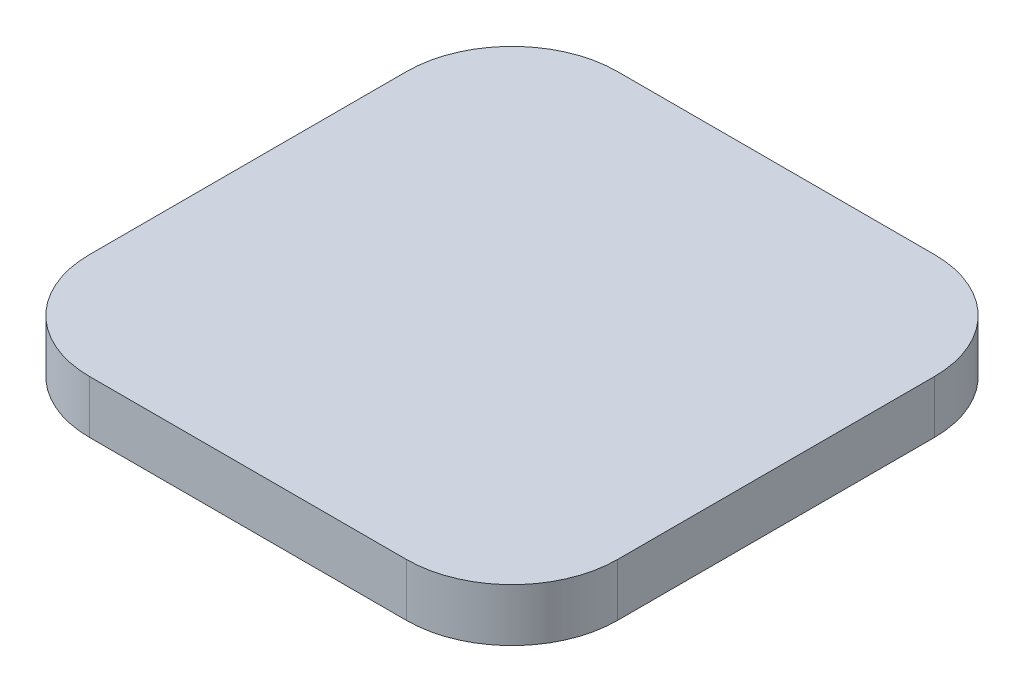
ISO-10303-21;
HEADER;
FILE_DESCRIPTION(('STEP AP214'),'2;1');
FILE_NAME('part.step','',(''),(''),'','','');
FILE_SCHEMA(('AUTOMOTIVE_DESIGN { 1 0 10303 214 1 1 1 1 }'));
ENDSEC;
DATA;
#1=APPLICATION_CONTEXT('core data for automotive mechanical design processes');
#2=APPLICATION_PROTOCOL_DEFINITION('international standard','automotive_design',2000,#1);
#3=PRODUCT_CONTEXT('',#1,'mechanical');
#4=PRODUCT('Part','Part','',(#3));
#5=PRODUCT_RELATED_PRODUCT_CATEGORY('part','',(#4));
#6=PRODUCT_DEFINITION_FORMATION('','',#4);
#7=PRODUCT_DEFINITION_CONTEXT('part definition',#1,'design');
#8=PRODUCT_DEFINITION('design','',#6,#7);
#9=PRODUCT_DEFINITION_SHAPE('','',#8);
#10=(LENGTH_UNIT() NAMED_UNIT(*) SI_UNIT(.MILLI.,.METRE.));
#11=(NAMED_UNIT(*) PLANE_ANGLE_UNIT() SI_UNIT($,.RADIAN.));
#12=(NAMED_UNIT(*) SI_UNIT($,.STERADIAN.) SOLID_ANGLE_UNIT());
#13=UNCERTAINTY_MEASURE_WITH_UNIT(LENGTH_MEASURE(1.E-05),#10,'distance_accuracy_value','');
#14=(GEOMETRIC_REPRESENTATION_CONTEXT(3) GLOBAL_UNCERTAINTY_ASSIGNED_CONTEXT((#13)) GLOBAL_UNIT_ASSIGNED_CONTEXT((#10,
#11,#12)) REPRESENTATION_CONTEXT('',''));
#15=CARTESIAN_POINT('',(0.,0.,0.));
#16=DIRECTION('',(0.,0.,1.));
#17=DIRECTION('',(1.,0.,0.));
#18=AXIS2_PLACEMENT_3D('',#15,#16,#17);
#19=CARTESIAN_POINT('',(25.4,5.08,25.4));
#20=DIRECTION('',(-1.,0.,0.));
#21=DIRECTION('',(0.,0.,1.));
#22=AXIS2_PLACEMENT_3D('',#19,#20,#21);
#23=PLANE('',#22);
#24=DIRECTION('',(0.,0.,-1.));
#25=VECTOR('',#24,1.);
#26=CARTESIAN_POINT('',(25.4,0.,25.4));
#27=LINE('',#26,#25);
#28=CARTESIAN_POINT('',(25.4,0.,15.24));
#29=VERTEX_POINT('',#28);
#30=CARTESIAN_POINT('',(25.4,0.,-15.24));
#31=VERTEX_POINT('',#30);
#32=EDGE_CURVE('E128',#29,#31,#27,.T.);
#33=ORIENTED_EDGE('',*,*,#32,.T.);
#34=DIRECTION('',(0.,-1.,0.));
#35=VECTOR('',#34,1.);
#36=CARTESIAN_POINT('',(25.4,5.08,-15.24));
#37=LINE('',#36,#35);
#38=CARTESIAN_POINT('',(25.4,5.08,-15.24));
#39=VERTEX_POINT('',#38);
#40=EDGE_CURVE('E151',#31,#39,#37,.F.);
#41=ORIENTED_EDGE('',*,*,#40,.T.);
#42=DIRECTION('',(0.,0.,-1.));
#43=VECTOR('',#42,1.);
#44=CARTESIAN_POINT('',(25.4,5.08,25.4));
#45=LINE('',#44,#43);
#46=CARTESIAN_POINT('',(25.4,5.08,15.24));
#47=VERTEX_POINT('',#46);
#48=EDGE_CURVE('E126',#47,#39,#45,.T.);
#49=ORIENTED_EDGE('',*,*,#48,.F.);
#50=DIRECTION('',(0.,-1.,0.));
#51=VECTOR('',#50,1.);
#52=CARTESIAN_POINT('',(25.4,5.08,15.24));
#53=LINE('',#52,#51);
#54=EDGE_CURVE('E148',#47,#29,#53,.T.);
#55=ORIENTED_EDGE('',*,*,#54,.T.);
#56=EDGE_LOOP('',(#33,#41,#49,#55));
#57=FACE_BOUND('',#56,.T.);
#58=ADVANCED_FACE('F33',(#57),#23,.F.);
#59=CARTESIAN_POINT('',(-25.4,5.08,-25.4));
#60=DIRECTION('',(0.,0.,1.));
#61=DIRECTION('',(1.,0.,0.));
#62=AXIS2_PLACEMENT_3D('',#59,#60,#61);
#63=PLANE('',#62);
#64=DIRECTION('',(-1.,0.,0.));
#65=VECTOR('',#64,1.);
#66=CARTESIAN_POINT('',(-25.4,0.,-25.4));
#67=LINE('',#66,#65);
#68=CARTESIAN_POINT('',(15.24,0.,-25.4));
#69=VERTEX_POINT('',#68);
#70=CARTESIAN_POINT('',(-15.24,0.,-25.4));
#71=VERTEX_POINT('',#70);
#72=EDGE_CURVE('E124',#69,#71,#67,.T.);
#73=ORIENTED_EDGE('',*,*,#72,.T.);
#74=DIRECTION('',(0.,-1.,0.));
#75=VECTOR('',#74,1.);
#76=CARTESIAN_POINT('',(-15.24,5.08,-25.4));
#77=LINE('',#76,#75);
#78=CARTESIAN_POINT('',(-15.24,5.08,-25.4));
#79=VERTEX_POINT('',#78);
#80=EDGE_CURVE('E103',#71,#79,#77,.F.);
#81=ORIENTED_EDGE('',*,*,#80,.T.);
#82=DIRECTION('',(-1.,0.,0.));
#83=VECTOR('',#82,1.);
#84=CARTESIAN_POINT('',(-25.4,5.08,-25.4));
#85=LINE('',#84,#83);
#86=CARTESIAN_POINT('',(15.24,5.08,-25.4));
#87=VERTEX_POINT('',#86);
#88=EDGE_CURVE('E167',#87,#79,#85,.T.);
#89=ORIENTED_EDGE('',*,*,#88,.F.);
#90=DIRECTION('',(0.,-1.,0.));
#91=VECTOR('',#90,1.);
#92=CARTESIAN_POINT('',(15.24,5.08,-25.4));
#93=LINE('',#92,#91);
#94=EDGE_CURVE('E108',#87,#69,#93,.T.);
#95=ORIENTED_EDGE('',*,*,#94,.T.);
#96=EDGE_LOOP('',(#73,#81,#89,#95));
#97=FACE_BOUND('',#96,.T.);
#98=ADVANCED_FACE('F184',(#97),#63,.F.);
#99=CARTESIAN_POINT('',(-25.4,5.08,25.4));
#100=DIRECTION('',(1.,0.,0.));
#101=DIRECTION('',(0.,0.,-1.));
#102=AXIS2_PLACEMENT_3D('',#99,#100,#101);
#103=PLANE('',#102);
#104=DIRECTION('',(0.,0.,1.));
#105=VECTOR('',#104,1.);
#106=CARTESIAN_POINT('',(-25.4,5.08,25.4));
#107=LINE('',#106,#105);
#108=CARTESIAN_POINT('',(-25.4,5.08,-15.24));
#109=VERTEX_POINT('',#108);
#110=CARTESIAN_POINT('',(-25.4,5.08,15.24));
#111=VERTEX_POINT('',#110);
#112=EDGE_CURVE('E117',#109,#111,#107,.T.);
#113=ORIENTED_EDGE('',*,*,#112,.F.);
#114=DIRECTION('',(0.,-1.,0.));
#115=VECTOR('',#114,1.);
#116=CARTESIAN_POINT('',(-25.4,5.08,-15.24));
#117=LINE('',#116,#115);
#118=CARTESIAN_POINT('',(-25.4,0.,-15.24));
#119=VERTEX_POINT('',#118);
#120=EDGE_CURVE('E102',#109,#119,#117,.T.);
#121=ORIENTED_EDGE('',*,*,#120,.T.);
#122=DIRECTION('',(0.,0.,1.));
#123=VECTOR('',#122,1.);
#124=CARTESIAN_POINT('',(-25.4,0.,25.4));
#125=LINE('',#124,#123);
#126=CARTESIAN_POINT('',(-25.4,0.,15.24));
#127=VERTEX_POINT('',#126);
#128=EDGE_CURVE('E115',#119,#127,#125,.T.);
#129=ORIENTED_EDGE('',*,*,#128,.T.);
#130=DIRECTION('',(0.,-1.,0.));
#131=VECTOR('',#130,1.);
#132=CARTESIAN_POINT('',(-25.4,5.08,15.24));
#133=LINE('',#132,#131);
#134=EDGE_CURVE('E119',#127,#111,#133,.F.);
#135=ORIENTED_EDGE('',*,*,#134,.T.);
#136=EDGE_LOOP('',(#113,#121,#129,#135));
#137=FACE_BOUND('',#136,.T.);
#138=ADVANCED_FACE('F114',(#137),#103,.F.);
#139=CARTESIAN_POINT('',(-25.4,5.08,25.4));
#140=DIRECTION('',(0.,0.,-1.));
#141=DIRECTION('',(-1.,0.,0.));
#142=AXIS2_PLACEMENT_3D('',#139,#140,#141);
#143=PLANE('',#142);
#144=DIRECTION('',(1.,0.,0.));
#145=VECTOR('',#144,1.);
#146=CARTESIAN_POINT('',(-25.4,0.,25.4));
#147=LINE('',#146,#145);
#148=CARTESIAN_POINT('',(-15.24,0.,25.4));
#149=VERTEX_POINT('',#148);
#150=CARTESIAN_POINT('',(15.24,0.,25.4));
#151=VERTEX_POINT('',#150);
#152=EDGE_CURVE('E123',#149,#151,#147,.T.);
#153=ORIENTED_EDGE('',*,*,#152,.T.);
#154=DIRECTION('',(0.,-1.,0.));
#155=VECTOR('',#154,1.);
#156=CARTESIAN_POINT('',(15.24,5.08,25.4));
#157=LINE('',#156,#155);
#158=CARTESIAN_POINT('',(15.24,5.08,25.4));
#159=VERTEX_POINT('',#158);
#160=EDGE_CURVE('E11',#151,#159,#157,.F.);
#161=ORIENTED_EDGE('',*,*,#160,.T.);
#162=DIRECTION('',(1.,0.,0.));
#163=VECTOR('',#162,1.);
#164=CARTESIAN_POINT('',(-25.4,5.08,25.4));
#165=LINE('',#164,#163);
#166=CARTESIAN_POINT('',(-15.24,5.08,25.4));
#167=VERTEX_POINT('',#166);
#168=EDGE_CURVE('E132',#167,#159,#165,.T.);
#169=ORIENTED_EDGE('',*,*,#168,.F.);
#170=DIRECTION('',(0.,-1.,0.));
#171=VECTOR('',#170,1.);
#172=CARTESIAN_POINT('',(-15.24,5.08,25.4));
#173=LINE('',#172,#171);
#174=EDGE_CURVE('E41',#167,#149,#173,.T.);
#175=ORIENTED_EDGE('',*,*,#174,.T.);
#176=EDGE_LOOP('',(#153,#161,#169,#175));
#177=FACE_BOUND('',#176,.T.);
#178=ADVANCED_FACE('F154',(#177),#143,.F.);
#179=CARTESIAN_POINT('',(0.,5.08,0.));
#180=DIRECTION('',(0.,-1.,0.));
#181=DIRECTION('',(0.,0.,-1.));
#182=AXIS2_PLACEMENT_3D('',#179,#180,#181);
#183=PLANE('',#182);
#184=ORIENTED_EDGE('',*,*,#88,.T.);
#185=CARTESIAN_POINT('',(-15.24,5.08,-15.24));
#186=DIRECTION('',(0.,-1.,0.));
#187=DIRECTION('',(0.,0.,-1.));
#188=AXIS2_PLACEMENT_3D('',#185,#186,#187);
#189=CIRCLE('',#188,10.16);
#190=EDGE_CURVE('E146',#79,#109,#189,.F.);
#191=ORIENTED_EDGE('',*,*,#190,.T.);
#192=ORIENTED_EDGE('',*,*,#112,.T.);
#193=CARTESIAN_POINT('',(-15.24,5.08,15.24));
#194=DIRECTION('',(0.,-1.,0.));
#195=DIRECTION('',(0.,0.,-1.));
#196=AXIS2_PLACEMENT_3D('',#193,#194,#195);
#197=CIRCLE('',#196,10.16);
#198=EDGE_CURVE('E53',#111,#167,#197,.F.);
#199=ORIENTED_EDGE('',*,*,#198,.T.);
#200=ORIENTED_EDGE('',*,*,#168,.T.);
#201=CARTESIAN_POINT('',(15.24,5.08,15.24));
#202=DIRECTION('',(0.,-1.,0.));
#203=DIRECTION('',(0.,0.,-1.));
#204=AXIS2_PLACEMENT_3D('',#201,#202,#203);
#205=CIRCLE('',#204,10.16);
#206=EDGE_CURVE('E142',#159,#47,#205,.F.);
#207=ORIENTED_EDGE('',*,*,#206,.T.);
#208=ORIENTED_EDGE('',*,*,#48,.T.);
#209=CARTESIAN_POINT('',(15.24,5.08,-15.24));
#210=DIRECTION('',(0.,-1.,0.));
#211=DIRECTION('',(0.,0.,-1.));
#212=AXIS2_PLACEMENT_3D('',#209,#210,#211);
#213=CIRCLE('',#212,10.16);
#214=EDGE_CURVE('E144',#39,#87,#213,.F.);
#215=ORIENTED_EDGE('',*,*,#214,.T.);
#216=EDGE_LOOP('',(#184,#191,#192,#199,#200,#207,#208,#215));
#217=FACE_BOUND('',#216,.T.);
#218=ADVANCED_FACE('F173',(#217),#183,.F.);
#219=CARTESIAN_POINT('',(0.,0.,0.));
#220=DIRECTION('',(0.,-1.,0.));
#221=DIRECTION('',(0.,0.,-1.));
#222=AXIS2_PLACEMENT_3D('',#219,#220,#221);
#223=PLANE('',#222);
#224=ORIENTED_EDGE('',*,*,#128,.F.);
#225=CARTESIAN_POINT('',(-15.24,0.,-15.24));
#226=DIRECTION('',(0.,-1.,0.));
#227=DIRECTION('',(0.,0.,-1.));
#228=AXIS2_PLACEMENT_3D('',#225,#226,#227);
#229=CIRCLE('',#228,10.16);
#230=EDGE_CURVE('E98',#119,#71,#229,.T.);
#231=ORIENTED_EDGE('',*,*,#230,.T.);
#232=ORIENTED_EDGE('',*,*,#72,.F.);
#233=CARTESIAN_POINT('',(15.24,0.,-15.24));
#234=DIRECTION('',(0.,-1.,0.));
#235=DIRECTION('',(0.,0.,-1.));
#236=AXIS2_PLACEMENT_3D('',#233,#234,#235);
#237=CIRCLE('',#236,10.16);
#238=EDGE_CURVE('E109',#69,#31,#237,.T.);
#239=ORIENTED_EDGE('',*,*,#238,.T.);
#240=ORIENTED_EDGE('',*,*,#32,.F.);
#241=CARTESIAN_POINT('',(15.24,0.,15.24));
#242=DIRECTION('',(0.,-1.,0.));
#243=DIRECTION('',(0.,0.,-1.));
#244=AXIS2_PLACEMENT_3D('',#241,#242,#243);
#245=CIRCLE('',#244,10.16);
#246=EDGE_CURVE('E135',#29,#151,#245,.T.);
#247=ORIENTED_EDGE('',*,*,#246,.T.);
#248=ORIENTED_EDGE('',*,*,#152,.F.);
#249=CARTESIAN_POINT('',(-15.24,0.,15.24));
#250=DIRECTION('',(0.,-1.,0.));
#251=DIRECTION('',(0.,0.,-1.));
#252=AXIS2_PLACEMENT_3D('',#249,#250,#251);
#253=CIRCLE('',#252,10.16);
#254=EDGE_CURVE('E118',#149,#127,#253,.T.);
#255=ORIENTED_EDGE('',*,*,#254,.T.);
#256=EDGE_LOOP('',(#224,#231,#232,#239,#240,#247,#248,#255));
#257=FACE_BOUND('',#256,.T.);
#258=ADVANCED_FACE('F121',(#257),#223,.T.);
#259=CARTESIAN_POINT('',(-15.24,5.08,-15.24));
#260=DIRECTION('',(0.,-1.,0.));
#261=DIRECTION('',(0.,0.,-1.));
#262=AXIS2_PLACEMENT_3D('',#259,#260,#261);
#263=CYLINDRICAL_SURFACE('',#262,10.16);
#264=ORIENTED_EDGE('',*,*,#190,.F.);
#265=ORIENTED_EDGE('',*,*,#80,.F.);
#266=ORIENTED_EDGE('',*,*,#230,.F.);
#267=ORIENTED_EDGE('',*,*,#120,.F.);
#268=EDGE_LOOP('',(#264,#265,#266,#267));
#269=FACE_BOUND('',#268,.T.);
#270=ADVANCED_FACE('F101',(#269),#263,.T.);
#271=CARTESIAN_POINT('',(15.24,5.08,-15.24));
#272=DIRECTION('',(0.,-1.,0.));
#273=DIRECTION('',(0.,0.,-1.));
#274=AXIS2_PLACEMENT_3D('',#271,#272,#273);
#275=CYLINDRICAL_SURFACE('',#274,10.16);
#276=ORIENTED_EDGE('',*,*,#214,.F.);
#277=ORIENTED_EDGE('',*,*,#40,.F.);
#278=ORIENTED_EDGE('',*,*,#238,.F.);
#279=ORIENTED_EDGE('',*,*,#94,.F.);
#280=EDGE_LOOP('',(#276,#277,#278,#279));
#281=FACE_BOUND('',#280,.T.);
#282=ADVANCED_FACE('F195',(#281),#275,.T.);
#283=CARTESIAN_POINT('',(15.24,5.08,15.24));
#284=DIRECTION('',(0.,-1.,0.));
#285=DIRECTION('',(0.,0.,-1.));
#286=AXIS2_PLACEMENT_3D('',#283,#284,#285);
#287=CYLINDRICAL_SURFACE('',#286,10.16);
#288=ORIENTED_EDGE('',*,*,#206,.F.);
#289=ORIENTED_EDGE('',*,*,#160,.F.);
#290=ORIENTED_EDGE('',*,*,#246,.F.);
#291=ORIENTED_EDGE('',*,*,#54,.F.);
#292=EDGE_LOOP('',(#288,#289,#290,#291));
#293=FACE_BOUND('',#292,.T.);
#294=ADVANCED_FACE('F161',(#293),#287,.T.);
#295=CARTESIAN_POINT('',(-15.24,5.08,15.24));
#296=DIRECTION('',(0.,-1.,0.));
#297=DIRECTION('',(0.,0.,-1.));
#298=AXIS2_PLACEMENT_3D('',#295,#296,#297);
#299=CYLINDRICAL_SURFACE('',#298,10.16);
#300=ORIENTED_EDGE('',*,*,#198,.F.);
#301=ORIENTED_EDGE('',*,*,#134,.F.);
#302=ORIENTED_EDGE('',*,*,#254,.F.);
#303=ORIENTED_EDGE('',*,*,#174,.F.);
#304=EDGE_LOOP('',(#300,#301,#302,#303));
#305=FACE_BOUND('',#304,.T.);
#306=ADVANCED_FACE('F35',(#305),#299,.T.);
#307=CLOSED_SHELL('',(#58,#98,#138,#178,#218,#258,#270,#282,#294,#306));
#308=MANIFOLD_SOLID_BREP('B2',#307);
#309=ADVANCED_BREP_SHAPE_REPRESENTATION('',(#18,#308),#14);
#310=SHAPE_DEFINITION_REPRESENTATION(#9,#309);
ENDSEC;
END-ISO-10303-21;
